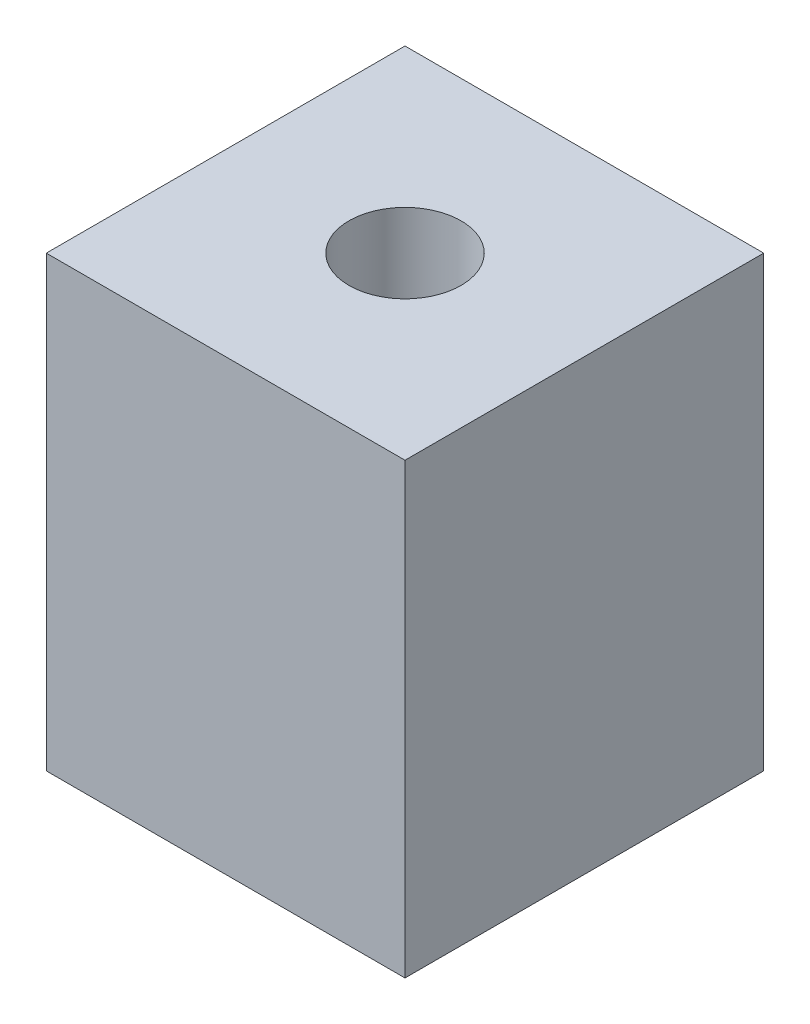
ISO-10303-21;
HEADER;
FILE_DESCRIPTION(('STEP AP214'),'2;1');
FILE_NAME('part.step','',(''),(''),'','','');
FILE_SCHEMA(('AUTOMOTIVE_DESIGN { 1 0 10303 214 1 1 1 1 }'));
ENDSEC;
DATA;
#1=APPLICATION_CONTEXT('core data for automotive mechanical design processes');
#2=APPLICATION_PROTOCOL_DEFINITION('international standard','automotive_design',2000,#1);
#3=PRODUCT_CONTEXT('',#1,'mechanical');
#4=PRODUCT('Part','Part','',(#3));
#5=PRODUCT_RELATED_PRODUCT_CATEGORY('part','',(#4));
#6=PRODUCT_DEFINITION_FORMATION('','',#4);
#7=PRODUCT_DEFINITION_CONTEXT('part definition',#1,'design');
#8=PRODUCT_DEFINITION('design','',#6,#7);
#9=PRODUCT_DEFINITION_SHAPE('','',#8);
#10=(LENGTH_UNIT() NAMED_UNIT(*) SI_UNIT(.MILLI.,.METRE.));
#11=(NAMED_UNIT(*) PLANE_ANGLE_UNIT() SI_UNIT($,.RADIAN.));
#12=(NAMED_UNIT(*) SI_UNIT($,.STERADIAN.) SOLID_ANGLE_UNIT());
#13=UNCERTAINTY_MEASURE_WITH_UNIT(LENGTH_MEASURE(1.E-05),#10,'distance_accuracy_value','');
#14=(GEOMETRIC_REPRESENTATION_CONTEXT(3) GLOBAL_UNCERTAINTY_ASSIGNED_CONTEXT((#13)) GLOBAL_UNIT_ASSIGNED_CONTEXT((#10,
#11,#12)) REPRESENTATION_CONTEXT('',''));
#15=CARTESIAN_POINT('',(0.,0.,0.));
#16=DIRECTION('',(0.,0.,1.));
#17=DIRECTION('',(1.,0.,0.));
#18=AXIS2_PLACEMENT_3D('',#15,#16,#17);
#19=CARTESIAN_POINT('',(0.,40.,0.));
#20=DIRECTION('',(0.,1.,0.));
#21=DIRECTION('',(0.,0.,1.));
#22=AXIS2_PLACEMENT_3D('',#19,#20,#21);
#23=PLANE('',#22);
#24=DIRECTION('',(0.,0.,1.));
#25=VECTOR('',#24,1.);
#26=CARTESIAN_POINT('',(-16.,40.,0.));
#27=LINE('',#26,#25);
#28=CARTESIAN_POINT('',(-16.,40.,-16.));
#29=VERTEX_POINT('',#28);
#30=CARTESIAN_POINT('',(-16.,40.,16.));
#31=VERTEX_POINT('',#30);
#32=EDGE_CURVE('E132',#29,#31,#27,.T.);
#33=ORIENTED_EDGE('',*,*,#32,.T.);
#34=DIRECTION('',(1.,0.,0.));
#35=VECTOR('',#34,1.);
#36=CARTESIAN_POINT('',(0.,40.,16.));
#37=LINE('',#36,#35);
#38=CARTESIAN_POINT('',(16.,40.,16.));
#39=VERTEX_POINT('',#38);
#40=EDGE_CURVE('E134',#31,#39,#37,.T.);
#41=ORIENTED_EDGE('',*,*,#40,.T.);
#42=DIRECTION('',(0.,0.,-1.));
#43=VECTOR('',#42,1.);
#44=CARTESIAN_POINT('',(16.,40.,0.));
#45=LINE('',#44,#43);
#46=CARTESIAN_POINT('',(16.,40.,-16.));
#47=VERTEX_POINT('',#46);
#48=EDGE_CURVE('E97',#39,#47,#45,.T.);
#49=ORIENTED_EDGE('',*,*,#48,.T.);
#50=DIRECTION('',(-1.,0.,0.));
#51=VECTOR('',#50,1.);
#52=CARTESIAN_POINT('',(0.,40.,-16.));
#53=LINE('',#52,#51);
#54=EDGE_CURVE('E101',#47,#29,#53,.T.);
#55=ORIENTED_EDGE('',*,*,#54,.T.);
#56=EDGE_LOOP('',(#33,#41,#49,#55));
#57=FACE_BOUND('',#56,.T.);
#58=CARTESIAN_POINT('',(0.,40.,0.));
#59=DIRECTION('',(0.,1.,0.));
#60=DIRECTION('',(0.,0.,1.));
#61=AXIS2_PLACEMENT_3D('',#58,#59,#60);
#62=CIRCLE('',#61,5.);
#63=CARTESIAN_POINT('',(0.,40.,5.));
#64=VERTEX_POINT('',#63);
#65=EDGE_CURVE('E67',#64,#64,#62,.T.);
#66=ORIENTED_EDGE('',*,*,#65,.F.);
#67=EDGE_LOOP('',(#66));
#68=FACE_BOUND('',#67,.T.);
#69=ADVANCED_FACE('F63',(#57,#68),#23,.T.);
#70=CARTESIAN_POINT('',(0.,0.,0.));
#71=DIRECTION('',(0.,1.,0.));
#72=DIRECTION('',(0.,0.,1.));
#73=AXIS2_PLACEMENT_3D('',#70,#71,#72);
#74=PLANE('',#73);
#75=DIRECTION('',(0.,0.,1.));
#76=VECTOR('',#75,1.);
#77=CARTESIAN_POINT('',(-16.,0.,0.));
#78=LINE('',#77,#76);
#79=CARTESIAN_POINT('',(-16.,0.,-16.));
#80=VERTEX_POINT('',#79);
#81=CARTESIAN_POINT('',(-16.,0.,16.));
#82=VERTEX_POINT('',#81);
#83=EDGE_CURVE('E107',#80,#82,#78,.T.);
#84=ORIENTED_EDGE('',*,*,#83,.F.);
#85=DIRECTION('',(-1.,0.,0.));
#86=VECTOR('',#85,1.);
#87=CARTESIAN_POINT('',(0.,0.,-16.));
#88=LINE('',#87,#86);
#89=CARTESIAN_POINT('',(16.,0.,-16.));
#90=VERTEX_POINT('',#89);
#91=EDGE_CURVE('E80',#90,#80,#88,.T.);
#92=ORIENTED_EDGE('',*,*,#91,.F.);
#93=DIRECTION('',(0.,0.,-1.));
#94=VECTOR('',#93,1.);
#95=CARTESIAN_POINT('',(16.,0.,0.));
#96=LINE('',#95,#94);
#97=CARTESIAN_POINT('',(16.,0.,16.));
#98=VERTEX_POINT('',#97);
#99=EDGE_CURVE('E121',#98,#90,#96,.T.);
#100=ORIENTED_EDGE('',*,*,#99,.F.);
#101=DIRECTION('',(1.,0.,0.));
#102=VECTOR('',#101,1.);
#103=CARTESIAN_POINT('',(0.,0.,16.));
#104=LINE('',#103,#102);
#105=EDGE_CURVE('E113',#82,#98,#104,.T.);
#106=ORIENTED_EDGE('',*,*,#105,.F.);
#107=EDGE_LOOP('',(#84,#92,#100,#106));
#108=FACE_BOUND('',#107,.T.);
#109=CARTESIAN_POINT('',(0.,0.,0.));
#110=DIRECTION('',(0.,-1.,0.));
#111=DIRECTION('',(0.,0.,-1.));
#112=AXIS2_PLACEMENT_3D('',#109,#110,#111);
#113=CIRCLE('',#112,2.5);
#114=CARTESIAN_POINT('',(0.,0.,-2.5));
#115=VERTEX_POINT('',#114);
#116=EDGE_CURVE('E140',#115,#115,#113,.T.);
#117=ORIENTED_EDGE('',*,*,#116,.F.);
#118=EDGE_LOOP('',(#117));
#119=FACE_BOUND('',#118,.T.);
#120=ADVANCED_FACE('F65',(#108,#119),#74,.F.);
#121=CARTESIAN_POINT('',(0.,10.,0.));
#122=DIRECTION('',(0.,1.,0.));
#123=DIRECTION('',(0.,0.,1.));
#124=AXIS2_PLACEMENT_3D('',#121,#122,#123);
#125=CYLINDRICAL_SURFACE('',#124,5.);
#126=CARTESIAN_POINT('',(0.,10.,0.));
#127=DIRECTION('',(0.,1.,0.));
#128=DIRECTION('',(0.,0.,1.));
#129=AXIS2_PLACEMENT_3D('',#126,#127,#128);
#130=CIRCLE('',#129,5.);
#131=CARTESIAN_POINT('',(0.,10.,5.));
#132=VERTEX_POINT('',#131);
#133=EDGE_CURVE('E12',#132,#132,#130,.T.);
#134=ORIENTED_EDGE('',*,*,#133,.F.);
#135=EDGE_LOOP('',(#134));
#136=FACE_BOUND('',#135,.T.);
#137=ORIENTED_EDGE('',*,*,#65,.T.);
#138=EDGE_LOOP('',(#137));
#139=FACE_BOUND('',#138,.T.);
#140=ADVANCED_FACE('F151',(#136,#139),#125,.F.);
#141=CARTESIAN_POINT('',(0.,10.,0.));
#142=DIRECTION('',(0.,1.,0.));
#143=DIRECTION('',(0.,0.,1.));
#144=AXIS2_PLACEMENT_3D('',#141,#142,#143);
#145=PLANE('',#144);
#146=CARTESIAN_POINT('',(0.,10.,0.));
#147=DIRECTION('',(0.,-1.,0.));
#148=DIRECTION('',(0.,0.,-1.));
#149=AXIS2_PLACEMENT_3D('',#146,#147,#148);
#150=CIRCLE('',#149,2.5);
#151=CARTESIAN_POINT('',(0.,10.,-2.5));
#152=VERTEX_POINT('',#151);
#153=EDGE_CURVE('E143',#152,#152,#150,.T.);
#154=ORIENTED_EDGE('',*,*,#153,.T.);
#155=EDGE_LOOP('',(#154));
#156=FACE_BOUND('',#155,.T.);
#157=ORIENTED_EDGE('',*,*,#133,.T.);
#158=EDGE_LOOP('',(#157));
#159=FACE_BOUND('',#158,.T.);
#160=ADVANCED_FACE('F157',(#156,#159),#145,.T.);
#161=CARTESIAN_POINT('',(0.,10.,0.));
#162=DIRECTION('',(0.,-1.,0.));
#163=DIRECTION('',(0.,0.,-1.));
#164=AXIS2_PLACEMENT_3D('',#161,#162,#163);
#165=CYLINDRICAL_SURFACE('',#164,2.5);
#166=ORIENTED_EDGE('',*,*,#153,.F.);
#167=EDGE_LOOP('',(#166));
#168=FACE_BOUND('',#167,.T.);
#169=ORIENTED_EDGE('',*,*,#116,.T.);
#170=EDGE_LOOP('',(#169));
#171=FACE_BOUND('',#170,.T.);
#172=ADVANCED_FACE('F149',(#168,#171),#165,.F.);
#173=CARTESIAN_POINT('',(-16.,0.,0.));
#174=DIRECTION('',(-1.,0.,0.));
#175=DIRECTION('',(0.,0.,1.));
#176=AXIS2_PLACEMENT_3D('',#173,#174,#175);
#177=PLANE('',#176);
#178=ORIENTED_EDGE('',*,*,#83,.T.);
#179=DIRECTION('',(0.,1.,0.));
#180=VECTOR('',#179,1.);
#181=CARTESIAN_POINT('',(-16.,0.,16.));
#182=LINE('',#181,#180);
#183=EDGE_CURVE('E118',#82,#31,#182,.T.);
#184=ORIENTED_EDGE('',*,*,#183,.T.);
#185=ORIENTED_EDGE('',*,*,#32,.F.);
#186=DIRECTION('',(0.,1.,0.));
#187=VECTOR('',#186,1.);
#188=CARTESIAN_POINT('',(-16.,0.,-16.));
#189=LINE('',#188,#187);
#190=EDGE_CURVE('E138',#80,#29,#189,.T.);
#191=ORIENTED_EDGE('',*,*,#190,.F.);
#192=EDGE_LOOP('',(#178,#184,#185,#191));
#193=FACE_BOUND('',#192,.T.);
#194=ADVANCED_FACE('F169',(#193),#177,.T.);
#195=CARTESIAN_POINT('',(0.,0.,-16.));
#196=DIRECTION('',(0.,0.,-1.));
#197=DIRECTION('',(-1.,0.,0.));
#198=AXIS2_PLACEMENT_3D('',#195,#196,#197);
#199=PLANE('',#198);
#200=ORIENTED_EDGE('',*,*,#91,.T.);
#201=ORIENTED_EDGE('',*,*,#190,.T.);
#202=ORIENTED_EDGE('',*,*,#54,.F.);
#203=DIRECTION('',(0.,1.,0.));
#204=VECTOR('',#203,1.);
#205=CARTESIAN_POINT('',(16.,0.,-16.));
#206=LINE('',#205,#204);
#207=EDGE_CURVE('E125',#90,#47,#206,.T.);
#208=ORIENTED_EDGE('',*,*,#207,.F.);
#209=EDGE_LOOP('',(#200,#201,#202,#208));
#210=FACE_BOUND('',#209,.T.);
#211=ADVANCED_FACE('F172',(#210),#199,.T.);
#212=CARTESIAN_POINT('',(16.,0.,0.));
#213=DIRECTION('',(1.,0.,0.));
#214=DIRECTION('',(0.,0.,-1.));
#215=AXIS2_PLACEMENT_3D('',#212,#213,#214);
#216=PLANE('',#215);
#217=ORIENTED_EDGE('',*,*,#99,.T.);
#218=ORIENTED_EDGE('',*,*,#207,.T.);
#219=ORIENTED_EDGE('',*,*,#48,.F.);
#220=DIRECTION('',(0.,1.,0.));
#221=VECTOR('',#220,1.);
#222=CARTESIAN_POINT('',(16.,0.,16.));
#223=LINE('',#222,#221);
#224=EDGE_CURVE('E117',#98,#39,#223,.T.);
#225=ORIENTED_EDGE('',*,*,#224,.F.);
#226=EDGE_LOOP('',(#217,#218,#219,#225));
#227=FACE_BOUND('',#226,.T.);
#228=ADVANCED_FACE('F124',(#227),#216,.T.);
#229=CARTESIAN_POINT('',(0.,0.,16.));
#230=DIRECTION('',(0.,0.,1.));
#231=DIRECTION('',(1.,0.,0.));
#232=AXIS2_PLACEMENT_3D('',#229,#230,#231);
#233=PLANE('',#232);
#234=ORIENTED_EDGE('',*,*,#105,.T.);
#235=ORIENTED_EDGE('',*,*,#224,.T.);
#236=ORIENTED_EDGE('',*,*,#40,.F.);
#237=ORIENTED_EDGE('',*,*,#183,.F.);
#238=EDGE_LOOP('',(#234,#235,#236,#237));
#239=FACE_BOUND('',#238,.T.);
#240=ADVANCED_FACE('F115',(#239),#233,.T.);
#241=CLOSED_SHELL('',(#69,#120,#140,#160,#172,#194,#211,#228,#240));
#242=MANIFOLD_SOLID_BREP('B2',#241);
#243=ADVANCED_BREP_SHAPE_REPRESENTATION('',(#18,#242),#14);
#244=SHAPE_DEFINITION_REPRESENTATION(#9,#243);
ENDSEC;
END-ISO-10303-21;
